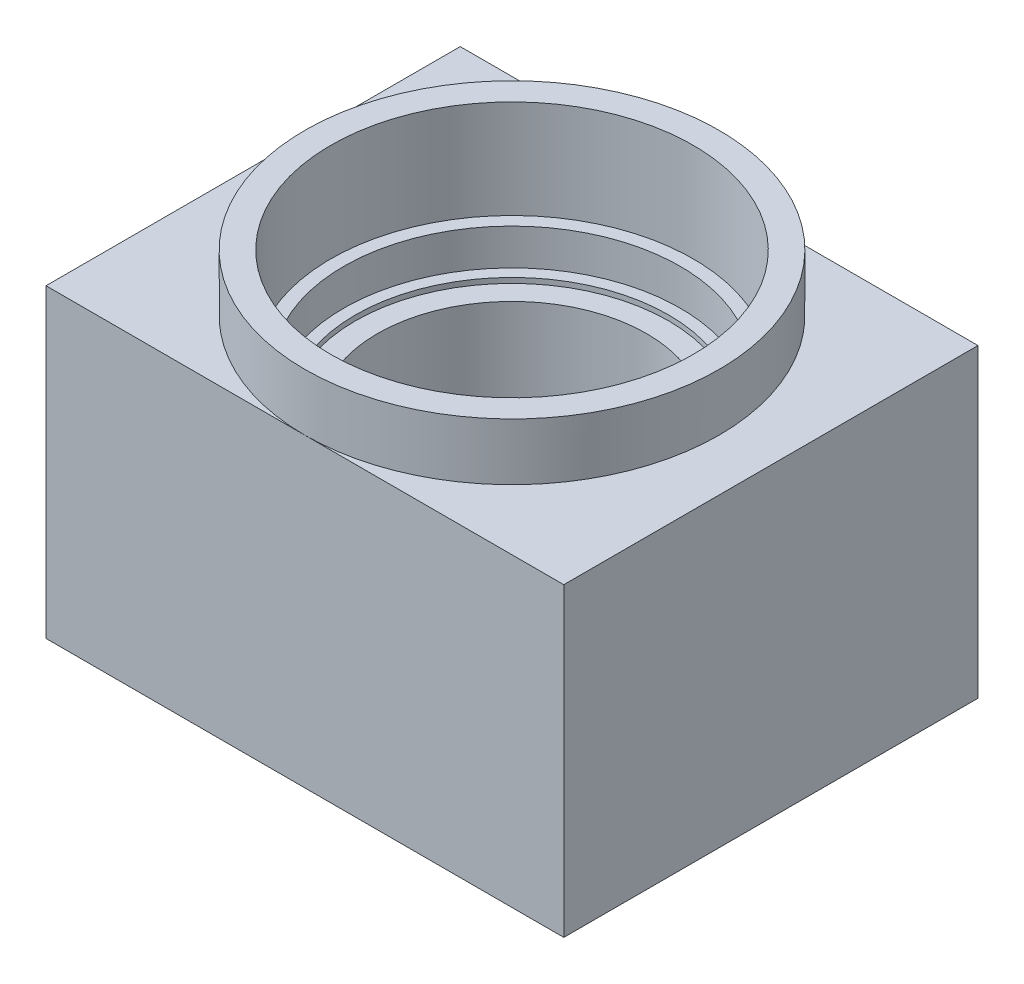
ISO-10303-21;
HEADER;
FILE_DESCRIPTION(('STEP AP214'),'2;1');
FILE_NAME('part.step','',(''),(''),'','','');
FILE_SCHEMA(('AUTOMOTIVE_DESIGN { 1 0 10303 214 1 1 1 1 }'));
ENDSEC;
DATA;
#1=APPLICATION_CONTEXT('core data for automotive mechanical design processes');
#2=APPLICATION_PROTOCOL_DEFINITION('international standard','automotive_design',2000,#1);
#3=PRODUCT_CONTEXT('',#1,'mechanical');
#4=PRODUCT('Part','Part','',(#3));
#5=PRODUCT_RELATED_PRODUCT_CATEGORY('part','',(#4));
#6=PRODUCT_DEFINITION_FORMATION('','',#4);
#7=PRODUCT_DEFINITION_CONTEXT('part definition',#1,'design');
#8=PRODUCT_DEFINITION('design','',#6,#7);
#9=PRODUCT_DEFINITION_SHAPE('','',#8);
#10=(LENGTH_UNIT() NAMED_UNIT(*) SI_UNIT(.MILLI.,.METRE.));
#11=(NAMED_UNIT(*) PLANE_ANGLE_UNIT() SI_UNIT($,.RADIAN.));
#12=(NAMED_UNIT(*) SI_UNIT($,.STERADIAN.) SOLID_ANGLE_UNIT());
#13=UNCERTAINTY_MEASURE_WITH_UNIT(LENGTH_MEASURE(1.E-05),#10,'distance_accuracy_value','');
#14=(GEOMETRIC_REPRESENTATION_CONTEXT(3) GLOBAL_UNCERTAINTY_ASSIGNED_CONTEXT((#13)) GLOBAL_UNIT_ASSIGNED_CONTEXT((#10,
#11,#12)) REPRESENTATION_CONTEXT('',''));
#15=CARTESIAN_POINT('',(0.,0.,0.));
#16=DIRECTION('',(0.,0.,1.));
#17=DIRECTION('',(1.,0.,0.));
#18=AXIS2_PLACEMENT_3D('',#15,#16,#17);
#19=CARTESIAN_POINT('',(0.,70.,0.));
#20=DIRECTION('',(0.,1.,0.));
#21=DIRECTION('',(0.,0.,1.));
#22=AXIS2_PLACEMENT_3D('',#19,#20,#21);
#23=PLANE('',#22);
#24=CARTESIAN_POINT('',(0.,70.,0.));
#25=DIRECTION('',(0.,1.,0.));
#26=DIRECTION('',(0.,0.,1.));
#27=AXIS2_PLACEMENT_3D('',#24,#25,#26);
#28=CIRCLE('',#27,35.);
#29=CARTESIAN_POINT('',(0.,70.,35.));
#30=VERTEX_POINT('',#29);
#31=EDGE_CURVE('E166',#30,#30,#28,.T.);
#32=ORIENTED_EDGE('',*,*,#31,.F.);
#33=EDGE_LOOP('',(#32));
#34=FACE_BOUND('',#33,.T.);
#35=CARTESIAN_POINT('',(0.,70.,0.));
#36=DIRECTION('',(0.,1.,0.));
#37=DIRECTION('',(0.,0.,1.));
#38=AXIS2_PLACEMENT_3D('',#35,#36,#37);
#39=CIRCLE('',#38,40.);
#40=CARTESIAN_POINT('',(0.,70.,40.));
#41=VERTEX_POINT('',#40);
#42=EDGE_CURVE('E147',#41,#41,#39,.T.);
#43=ORIENTED_EDGE('',*,*,#42,.T.);
#44=EDGE_LOOP('',(#43));
#45=FACE_BOUND('',#44,.T.);
#46=ADVANCED_FACE('F70',(#34,#45),#23,.T.);
#47=CARTESIAN_POINT('',(-50.,70.,-40.));
#48=DIRECTION('',(0.,0.,1.));
#49=DIRECTION('',(1.,0.,0.));
#50=AXIS2_PLACEMENT_3D('',#47,#48,#49);
#51=PLANE('',#50);
#52=DIRECTION('',(-1.,0.,0.));
#53=VECTOR('',#52,1.);
#54=CARTESIAN_POINT('',(0.,59.,-40.));
#55=LINE('',#54,#53);
#56=CARTESIAN_POINT('',(0.,59.,-40.));
#57=VERTEX_POINT('',#56);
#58=CARTESIAN_POINT('',(-50.,59.,-40.));
#59=VERTEX_POINT('',#58);
#60=EDGE_CURVE('E124',#57,#59,#55,.T.);
#61=ORIENTED_EDGE('',*,*,#60,.F.);
#62=DIRECTION('',(-1.,0.,0.));
#63=VECTOR('',#62,1.);
#64=CARTESIAN_POINT('',(0.,59.,-40.));
#65=LINE('',#64,#63);
#66=CARTESIAN_POINT('',(50.,59.,-40.));
#67=VERTEX_POINT('',#66);
#68=EDGE_CURVE('E136',#67,#57,#65,.T.);
#69=ORIENTED_EDGE('',*,*,#68,.F.);
#70=DIRECTION('',(0.,-1.,0.));
#71=VECTOR('',#70,1.);
#72=CARTESIAN_POINT('',(50.,70.,-40.));
#73=LINE('',#72,#71);
#74=CARTESIAN_POINT('',(50.,0.,-40.));
#75=VERTEX_POINT('',#74);
#76=EDGE_CURVE('E79',#67,#75,#73,.T.);
#77=ORIENTED_EDGE('',*,*,#76,.T.);
#78=DIRECTION('',(-1.,0.,0.));
#79=VECTOR('',#78,1.);
#80=CARTESIAN_POINT('',(-50.,0.,-40.));
#81=LINE('',#80,#79);
#82=CARTESIAN_POINT('',(-50.,0.,-40.));
#83=VERTEX_POINT('',#82);
#84=EDGE_CURVE('E185',#75,#83,#81,.T.);
#85=ORIENTED_EDGE('',*,*,#84,.T.);
#86=DIRECTION('',(0.,-1.,0.));
#87=VECTOR('',#86,1.);
#88=CARTESIAN_POINT('',(-50.,70.,-40.));
#89=LINE('',#88,#87);
#90=EDGE_CURVE('E139',#59,#83,#89,.T.);
#91=ORIENTED_EDGE('',*,*,#90,.F.);
#92=EDGE_LOOP('',(#61,#69,#77,#85,#91));
#93=FACE_BOUND('',#92,.T.);
#94=ADVANCED_FACE('F134',(#93),#51,.F.);
#95=CARTESIAN_POINT('',(-50.,70.,-40.));
#96=DIRECTION('',(1.,0.,0.));
#97=DIRECTION('',(0.,0.,-1.));
#98=AXIS2_PLACEMENT_3D('',#95,#96,#97);
#99=PLANE('',#98);
#100=DIRECTION('',(0.,0.,1.));
#101=VECTOR('',#100,1.);
#102=CARTESIAN_POINT('',(-50.,59.,0.));
#103=LINE('',#102,#101);
#104=CARTESIAN_POINT('',(-50.,59.,40.));
#105=VERTEX_POINT('',#104);
#106=EDGE_CURVE('E140',#59,#105,#103,.T.);
#107=ORIENTED_EDGE('',*,*,#106,.F.);
#108=ORIENTED_EDGE('',*,*,#90,.T.);
#109=DIRECTION('',(0.,0.,1.));
#110=VECTOR('',#109,1.);
#111=CARTESIAN_POINT('',(-50.,0.,-40.));
#112=LINE('',#111,#110);
#113=CARTESIAN_POINT('',(-50.,0.,40.));
#114=VERTEX_POINT('',#113);
#115=EDGE_CURVE('E187',#83,#114,#112,.T.);
#116=ORIENTED_EDGE('',*,*,#115,.T.);
#117=DIRECTION('',(0.,-1.,0.));
#118=VECTOR('',#117,1.);
#119=CARTESIAN_POINT('',(-50.,70.,40.));
#120=LINE('',#119,#118);
#121=EDGE_CURVE('E94',#105,#114,#120,.T.);
#122=ORIENTED_EDGE('',*,*,#121,.F.);
#123=EDGE_LOOP('',(#107,#108,#116,#122));
#124=FACE_BOUND('',#123,.T.);
#125=ADVANCED_FACE('F227',(#124),#99,.F.);
#126=CARTESIAN_POINT('',(-50.,70.,40.));
#127=DIRECTION('',(0.,0.,-1.));
#128=DIRECTION('',(-1.,0.,0.));
#129=AXIS2_PLACEMENT_3D('',#126,#127,#128);
#130=PLANE('',#129);
#131=DIRECTION('',(1.,0.,0.));
#132=VECTOR('',#131,1.);
#133=CARTESIAN_POINT('',(0.,59.,40.));
#134=LINE('',#133,#132);
#135=CARTESIAN_POINT('',(0.,59.,40.));
#136=VERTEX_POINT('',#135);
#137=EDGE_CURVE('E126',#105,#136,#134,.T.);
#138=ORIENTED_EDGE('',*,*,#137,.F.);
#139=ORIENTED_EDGE('',*,*,#121,.T.);
#140=DIRECTION('',(1.,0.,0.));
#141=VECTOR('',#140,1.);
#142=CARTESIAN_POINT('',(-50.,0.,40.));
#143=LINE('',#142,#141);
#144=CARTESIAN_POINT('',(50.,0.,40.));
#145=VERTEX_POINT('',#144);
#146=EDGE_CURVE('E189',#114,#145,#143,.T.);
#147=ORIENTED_EDGE('',*,*,#146,.T.);
#148=DIRECTION('',(0.,-1.,0.));
#149=VECTOR('',#148,1.);
#150=CARTESIAN_POINT('',(50.,70.,40.));
#151=LINE('',#150,#149);
#152=CARTESIAN_POINT('',(50.,59.,40.));
#153=VERTEX_POINT('',#152);
#154=EDGE_CURVE('E87',#153,#145,#151,.T.);
#155=ORIENTED_EDGE('',*,*,#154,.F.);
#156=DIRECTION('',(1.,0.,0.));
#157=VECTOR('',#156,1.);
#158=CARTESIAN_POINT('',(0.,59.,40.));
#159=LINE('',#158,#157);
#160=EDGE_CURVE('E146',#136,#153,#159,.T.);
#161=ORIENTED_EDGE('',*,*,#160,.F.);
#162=EDGE_LOOP('',(#138,#139,#147,#155,#161));
#163=FACE_BOUND('',#162,.T.);
#164=ADVANCED_FACE('F231',(#163),#130,.F.);
#165=CARTESIAN_POINT('',(50.,70.,-40.));
#166=DIRECTION('',(-1.,0.,0.));
#167=DIRECTION('',(0.,0.,1.));
#168=AXIS2_PLACEMENT_3D('',#165,#166,#167);
#169=PLANE('',#168);
#170=DIRECTION('',(0.,0.,-1.));
#171=VECTOR('',#170,1.);
#172=CARTESIAN_POINT('',(50.,59.,0.));
#173=LINE('',#172,#171);
#174=EDGE_CURVE('E150',#153,#67,#173,.T.);
#175=ORIENTED_EDGE('',*,*,#174,.F.);
#176=ORIENTED_EDGE('',*,*,#154,.T.);
#177=DIRECTION('',(0.,0.,-1.));
#178=VECTOR('',#177,1.);
#179=CARTESIAN_POINT('',(50.,0.,-40.));
#180=LINE('',#179,#178);
#181=EDGE_CURVE('E183',#145,#75,#180,.T.);
#182=ORIENTED_EDGE('',*,*,#181,.T.);
#183=ORIENTED_EDGE('',*,*,#76,.F.);
#184=EDGE_LOOP('',(#175,#176,#182,#183));
#185=FACE_BOUND('',#184,.T.);
#186=ADVANCED_FACE('F72',(#185),#169,.F.);
#187=CARTESIAN_POINT('',(0.,70.,0.));
#188=DIRECTION('',(0.,-1.,0.));
#189=DIRECTION('',(0.,0.,-1.));
#190=AXIS2_PLACEMENT_3D('',#187,#188,#189);
#191=CYLINDRICAL_SURFACE('',#190,26.);
#192=CARTESIAN_POINT('',(0.,43.,0.));
#193=DIRECTION('',(0.,1.,0.));
#194=DIRECTION('',(0.,0.,1.));
#195=AXIS2_PLACEMENT_3D('',#192,#193,#194);
#196=CIRCLE('',#195,26.);
#197=CARTESIAN_POINT('',(0.,43.,26.));
#198=VERTEX_POINT('',#197);
#199=EDGE_CURVE('E182',#198,#198,#196,.T.);
#200=ORIENTED_EDGE('',*,*,#199,.T.);
#201=EDGE_LOOP('',(#200));
#202=FACE_BOUND('',#201,.T.);
#203=CARTESIAN_POINT('',(0.,9.,0.));
#204=DIRECTION('',(0.,-1.,0.));
#205=DIRECTION('',(0.,0.,-1.));
#206=AXIS2_PLACEMENT_3D('',#203,#204,#205);
#207=CIRCLE('',#206,26.);
#208=CARTESIAN_POINT('',(0.,9.,-26.));
#209=VERTEX_POINT('',#208);
#210=EDGE_CURVE('E74',#209,#209,#207,.T.);
#211=ORIENTED_EDGE('',*,*,#210,.T.);
#212=EDGE_LOOP('',(#211));
#213=FACE_BOUND('',#212,.T.);
#214=ADVANCED_FACE('F204',(#202,#213),#191,.F.);
#215=CARTESIAN_POINT('',(0.,43.,0.));
#216=DIRECTION('',(0.,1.,0.));
#217=DIRECTION('',(0.,0.,1.));
#218=AXIS2_PLACEMENT_3D('',#215,#216,#217);
#219=CYLINDRICAL_SURFACE('',#218,32.5);
#220=CARTESIAN_POINT('',(0.,44.,0.));
#221=DIRECTION('',(0.,1.,0.));
#222=DIRECTION('',(0.,0.,1.));
#223=AXIS2_PLACEMENT_3D('',#220,#221,#222);
#224=CIRCLE('',#223,32.5);
#225=CARTESIAN_POINT('',(0.,44.,32.5));
#226=VERTEX_POINT('',#225);
#227=EDGE_CURVE('E179',#226,#226,#224,.T.);
#228=ORIENTED_EDGE('',*,*,#227,.F.);
#229=EDGE_LOOP('',(#228));
#230=FACE_BOUND('',#229,.T.);
#231=CARTESIAN_POINT('',(0.,51.,0.));
#232=DIRECTION('',(0.,1.,0.));
#233=DIRECTION('',(0.,0.,1.));
#234=AXIS2_PLACEMENT_3D('',#231,#232,#233);
#235=CIRCLE('',#234,32.5);
#236=CARTESIAN_POINT('',(0.,51.,32.5));
#237=VERTEX_POINT('',#236);
#238=EDGE_CURVE('E175',#237,#237,#235,.F.);
#239=ORIENTED_EDGE('',*,*,#238,.F.);
#240=EDGE_LOOP('',(#239));
#241=FACE_BOUND('',#240,.T.);
#242=ADVANCED_FACE('F201',(#230,#241),#219,.F.);
#243=CARTESIAN_POINT('',(0.,0.,0.));
#244=DIRECTION('',(0.,1.,0.));
#245=DIRECTION('',(0.,0.,1.));
#246=AXIS2_PLACEMENT_3D('',#243,#244,#245);
#247=PLANE('',#246);
#248=CARTESIAN_POINT('',(0.,0.,0.));
#249=DIRECTION('',(0.,-1.,0.));
#250=DIRECTION('',(0.,0.,-1.));
#251=AXIS2_PLACEMENT_3D('',#248,#249,#250);
#252=CIRCLE('',#251,32.5);
#253=CARTESIAN_POINT('',(0.,0.,-32.5));
#254=VERTEX_POINT('',#253);
#255=EDGE_CURVE('E167',#254,#254,#252,.T.);
#256=ORIENTED_EDGE('',*,*,#255,.F.);
#257=EDGE_LOOP('',(#256));
#258=FACE_BOUND('',#257,.T.);
#259=ORIENTED_EDGE('',*,*,#181,.F.);
#260=ORIENTED_EDGE('',*,*,#146,.F.);
#261=ORIENTED_EDGE('',*,*,#115,.F.);
#262=ORIENTED_EDGE('',*,*,#84,.F.);
#263=EDGE_LOOP('',(#259,#260,#261,#262));
#264=FACE_BOUND('',#263,.T.);
#265=ADVANCED_FACE('F203',(#258,#264),#247,.F.);
#266=CARTESIAN_POINT('',(0.,43.,0.));
#267=DIRECTION('',(0.,1.,0.));
#268=DIRECTION('',(0.,0.,1.));
#269=AXIS2_PLACEMENT_3D('',#266,#267,#268);
#270=PLANE('',#269);
#271=CARTESIAN_POINT('',(0.,43.,0.));
#272=DIRECTION('',(0.,1.,0.));
#273=DIRECTION('',(0.,0.,1.));
#274=AXIS2_PLACEMENT_3D('',#271,#272,#273);
#275=CIRCLE('',#274,30.25);
#276=CARTESIAN_POINT('',(0.,43.,30.25));
#277=VERTEX_POINT('',#276);
#278=EDGE_CURVE('E14',#277,#277,#275,.F.);
#279=ORIENTED_EDGE('',*,*,#278,.F.);
#280=EDGE_LOOP('',(#279));
#281=FACE_BOUND('',#280,.T.);
#282=ORIENTED_EDGE('',*,*,#199,.F.);
#283=EDGE_LOOP('',(#282));
#284=FACE_BOUND('',#283,.T.);
#285=ADVANCED_FACE('F212',(#281,#284),#270,.T.);
#286=CARTESIAN_POINT('',(0.,44.,0.));
#287=DIRECTION('',(0.,-1.,0.));
#288=DIRECTION('',(0.,0.,-1.));
#289=AXIS2_PLACEMENT_3D('',#286,#287,#288);
#290=CYLINDRICAL_SURFACE('',#289,30.25);
#291=CARTESIAN_POINT('',(0.,44.,0.));
#292=DIRECTION('',(0.,1.,0.));
#293=DIRECTION('',(0.,0.,1.));
#294=AXIS2_PLACEMENT_3D('',#291,#292,#293);
#295=CIRCLE('',#294,30.25);
#296=CARTESIAN_POINT('',(0.,44.,30.25));
#297=VERTEX_POINT('',#296);
#298=EDGE_CURVE('E176',#297,#297,#295,.T.);
#299=ORIENTED_EDGE('',*,*,#298,.T.);
#300=EDGE_LOOP('',(#299));
#301=FACE_BOUND('',#300,.T.);
#302=ORIENTED_EDGE('',*,*,#278,.T.);
#303=EDGE_LOOP('',(#302));
#304=FACE_BOUND('',#303,.T.);
#305=ADVANCED_FACE('F371',(#301,#304),#290,.F.);
#306=CARTESIAN_POINT('',(0.,44.,0.));
#307=DIRECTION('',(0.,1.,0.));
#308=DIRECTION('',(0.,0.,1.));
#309=AXIS2_PLACEMENT_3D('',#306,#307,#308);
#310=PLANE('',#309);
#311=ORIENTED_EDGE('',*,*,#298,.F.);
#312=EDGE_LOOP('',(#311));
#313=FACE_BOUND('',#312,.T.);
#314=ORIENTED_EDGE('',*,*,#227,.T.);
#315=EDGE_LOOP('',(#314));
#316=FACE_BOUND('',#315,.T.);
#317=ADVANCED_FACE('F358',(#313,#316),#310,.T.);
#318=CARTESIAN_POINT('',(0.,51.,0.));
#319=DIRECTION('',(0.,1.,0.));
#320=DIRECTION('',(0.,0.,1.));
#321=AXIS2_PLACEMENT_3D('',#318,#319,#320);
#322=PLANE('',#321);
#323=CARTESIAN_POINT('',(0.,51.,0.));
#324=DIRECTION('',(0.,1.,0.));
#325=DIRECTION('',(0.,0.,1.));
#326=AXIS2_PLACEMENT_3D('',#323,#324,#325);
#327=CIRCLE('',#326,35.);
#328=CARTESIAN_POINT('',(0.,51.,35.));
#329=VERTEX_POINT('',#328);
#330=EDGE_CURVE('E172',#329,#329,#327,.F.);
#331=ORIENTED_EDGE('',*,*,#330,.F.);
#332=EDGE_LOOP('',(#331));
#333=FACE_BOUND('',#332,.T.);
#334=ORIENTED_EDGE('',*,*,#238,.T.);
#335=EDGE_LOOP('',(#334));
#336=FACE_BOUND('',#335,.T.);
#337=ADVANCED_FACE('F199',(#333,#336),#322,.T.);
#338=CARTESIAN_POINT('',(0.,-54.9949493661167,0.));
#339=DIRECTION('',(0.,1.,0.));
#340=DIRECTION('',(0.,0.,1.));
#341=AXIS2_PLACEMENT_3D('',#338,#339,#340);
#342=CYLINDRICAL_SURFACE('',#341,35.);
#343=ORIENTED_EDGE('',*,*,#330,.T.);
#344=EDGE_LOOP('',(#343));
#345=FACE_BOUND('',#344,.T.);
#346=ORIENTED_EDGE('',*,*,#31,.T.);
#347=EDGE_LOOP('',(#346));
#348=FACE_BOUND('',#347,.T.);
#349=ADVANCED_FACE('F340',(#345,#348),#342,.F.);
#350=CARTESIAN_POINT('',(0.,8.,0.));
#351=DIRECTION('',(0.,-1.,0.));
#352=DIRECTION('',(0.,0.,-1.));
#353=AXIS2_PLACEMENT_3D('',#350,#351,#352);
#354=CYLINDRICAL_SURFACE('',#353,32.5);
#355=CARTESIAN_POINT('',(0.,8.,0.));
#356=DIRECTION('',(0.,-1.,0.));
#357=DIRECTION('',(0.,0.,-1.));
#358=AXIS2_PLACEMENT_3D('',#355,#356,#357);
#359=CIRCLE('',#358,32.5);
#360=CARTESIAN_POINT('',(0.,8.,-32.5));
#361=VERTEX_POINT('',#360);
#362=EDGE_CURVE('E163',#361,#361,#359,.T.);
#363=ORIENTED_EDGE('',*,*,#362,.F.);
#364=EDGE_LOOP('',(#363));
#365=FACE_BOUND('',#364,.T.);
#366=ORIENTED_EDGE('',*,*,#255,.T.);
#367=EDGE_LOOP('',(#366));
#368=FACE_BOUND('',#367,.T.);
#369=ADVANCED_FACE('F330',(#365,#368),#354,.F.);
#370=CARTESIAN_POINT('',(0.,8.,0.));
#371=DIRECTION('',(0.,-1.,0.));
#372=DIRECTION('',(0.,0.,-1.));
#373=AXIS2_PLACEMENT_3D('',#370,#371,#372);
#374=PLANE('',#373);
#375=CARTESIAN_POINT('',(0.,8.,0.));
#376=DIRECTION('',(0.,-1.,0.));
#377=DIRECTION('',(0.,0.,-1.));
#378=AXIS2_PLACEMENT_3D('',#375,#376,#377);
#379=CIRCLE('',#378,30.25);
#380=CARTESIAN_POINT('',(0.,8.,-30.25));
#381=VERTEX_POINT('',#380);
#382=EDGE_CURVE('E151',#381,#381,#379,.T.);
#383=ORIENTED_EDGE('',*,*,#382,.F.);
#384=EDGE_LOOP('',(#383));
#385=FACE_BOUND('',#384,.T.);
#386=ORIENTED_EDGE('',*,*,#362,.T.);
#387=EDGE_LOOP('',(#386));
#388=FACE_BOUND('',#387,.T.);
#389=ADVANCED_FACE('F315',(#385,#388),#374,.T.);
#390=CARTESIAN_POINT('',(0.,9.,0.));
#391=DIRECTION('',(0.,-1.,0.));
#392=DIRECTION('',(0.,0.,-1.));
#393=AXIS2_PLACEMENT_3D('',#390,#391,#392);
#394=CYLINDRICAL_SURFACE('',#393,30.25);
#395=CARTESIAN_POINT('',(0.,9.,0.));
#396=DIRECTION('',(0.,-1.,0.));
#397=DIRECTION('',(0.,0.,-1.));
#398=AXIS2_PLACEMENT_3D('',#395,#396,#397);
#399=CIRCLE('',#398,30.25);
#400=CARTESIAN_POINT('',(0.,9.,-30.25));
#401=VERTEX_POINT('',#400);
#402=EDGE_CURVE('E154',#401,#401,#399,.T.);
#403=ORIENTED_EDGE('',*,*,#402,.F.);
#404=EDGE_LOOP('',(#403));
#405=FACE_BOUND('',#404,.T.);
#406=ORIENTED_EDGE('',*,*,#382,.T.);
#407=EDGE_LOOP('',(#406));
#408=FACE_BOUND('',#407,.T.);
#409=ADVANCED_FACE('F305',(#405,#408),#394,.F.);
#410=CARTESIAN_POINT('',(0.,9.,0.));
#411=DIRECTION('',(0.,-1.,0.));
#412=DIRECTION('',(0.,0.,-1.));
#413=AXIS2_PLACEMENT_3D('',#410,#411,#412);
#414=PLANE('',#413);
#415=ORIENTED_EDGE('',*,*,#210,.F.);
#416=EDGE_LOOP('',(#415));
#417=FACE_BOUND('',#416,.T.);
#418=ORIENTED_EDGE('',*,*,#402,.T.);
#419=EDGE_LOOP('',(#418));
#420=FACE_BOUND('',#419,.T.);
#421=ADVANCED_FACE('F257',(#417,#420),#414,.T.);
#422=CARTESIAN_POINT('',(0.,59.,0.));
#423=DIRECTION('',(0.,1.,0.));
#424=DIRECTION('',(0.,0.,1.));
#425=AXIS2_PLACEMENT_3D('',#422,#423,#424);
#426=CYLINDRICAL_SURFACE('',#425,40.);
#427=ORIENTED_EDGE('',*,*,#42,.F.);
#428=EDGE_LOOP('',(#427));
#429=FACE_BOUND('',#428,.T.);
#430=CARTESIAN_POINT('',(0.,59.,0.));
#431=DIRECTION('',(0.,1.,0.));
#432=DIRECTION('',(0.,0.,1.));
#433=AXIS2_PLACEMENT_3D('',#430,#431,#432);
#434=CIRCLE('',#433,40.);
#435=EDGE_CURVE('E121',#57,#136,#434,.T.);
#436=ORIENTED_EDGE('',*,*,#435,.T.);
#437=CARTESIAN_POINT('',(0.,59.,0.));
#438=DIRECTION('',(0.,1.,0.));
#439=DIRECTION('',(0.,0.,1.));
#440=AXIS2_PLACEMENT_3D('',#437,#438,#439);
#441=CIRCLE('',#440,40.);
#442=EDGE_CURVE('E142',#136,#57,#441,.T.);
#443=ORIENTED_EDGE('',*,*,#442,.T.);
#444=EDGE_LOOP('',(#436,#443));
#445=FACE_BOUND('',#444,.T.);
#446=ADVANCED_FACE('F143',(#429,#445),#426,.T.);
#447=CARTESIAN_POINT('',(0.,59.,0.));
#448=DIRECTION('',(0.,1.,0.));
#449=DIRECTION('',(0.,0.,1.));
#450=AXIS2_PLACEMENT_3D('',#447,#448,#449);
#451=PLANE('',#450);
#452=ORIENTED_EDGE('',*,*,#442,.F.);
#453=ORIENTED_EDGE('',*,*,#160,.T.);
#454=ORIENTED_EDGE('',*,*,#174,.T.);
#455=ORIENTED_EDGE('',*,*,#68,.T.);
#456=EDGE_LOOP('',(#452,#453,#454,#455));
#457=FACE_BOUND('',#456,.T.);
#458=ADVANCED_FACE('F149',(#457),#451,.T.);
#459=CARTESIAN_POINT('',(0.,59.,0.));
#460=DIRECTION('',(0.,1.,0.));
#461=DIRECTION('',(0.,0.,1.));
#462=AXIS2_PLACEMENT_3D('',#459,#460,#461);
#463=PLANE('',#462);
#464=ORIENTED_EDGE('',*,*,#435,.F.);
#465=ORIENTED_EDGE('',*,*,#60,.T.);
#466=ORIENTED_EDGE('',*,*,#106,.T.);
#467=ORIENTED_EDGE('',*,*,#137,.T.);
#468=EDGE_LOOP('',(#464,#465,#466,#467));
#469=FACE_BOUND('',#468,.T.);
#470=ADVANCED_FACE('F123',(#469),#463,.T.);
#471=CLOSED_SHELL('',(#46,#94,#125,#164,#186,#214,#242,#265,#285,#305,#317,#337,#349,#369,#389,
#409,#421,#446,#458,#470));
#472=MANIFOLD_SOLID_BREP('B2',#471);
#473=ADVANCED_BREP_SHAPE_REPRESENTATION('',(#18,#472),#14);
#474=SHAPE_DEFINITION_REPRESENTATION(#9,#473);
ENDSEC;
END-ISO-10303-21;
